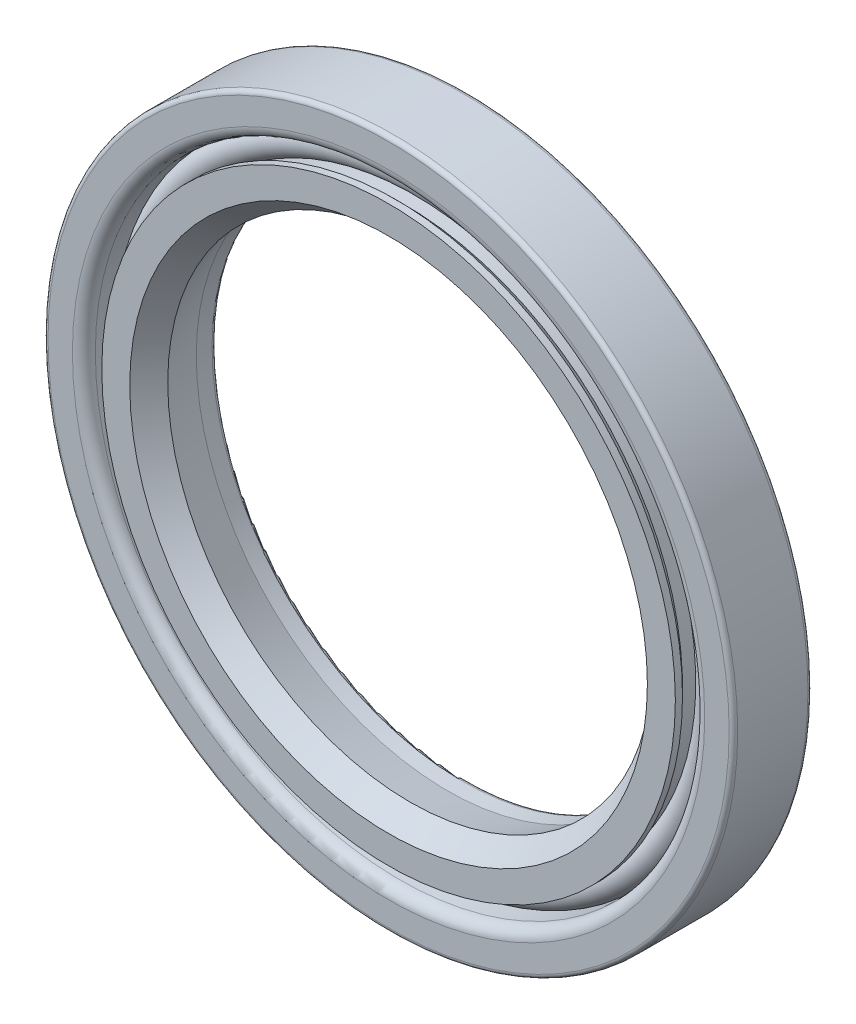
ISO-10303-21;
HEADER;
FILE_DESCRIPTION(('STEP AP214'),'2;1');
FILE_NAME('part.step','',(''),(''),'','','');
FILE_SCHEMA(('AUTOMOTIVE_DESIGN { 1 0 10303 214 1 1 1 1 }'));
ENDSEC;
DATA;
#1=APPLICATION_CONTEXT('core data for automotive mechanical design processes');
#2=APPLICATION_PROTOCOL_DEFINITION('international standard','automotive_design',2000,#1);
#3=PRODUCT_CONTEXT('',#1,'mechanical');
#4=PRODUCT('Part','Part','',(#3));
#5=PRODUCT_RELATED_PRODUCT_CATEGORY('part','',(#4));
#6=PRODUCT_DEFINITION_FORMATION('','',#4);
#7=PRODUCT_DEFINITION_CONTEXT('part definition',#1,'design');
#8=PRODUCT_DEFINITION('design','',#6,#7);
#9=PRODUCT_DEFINITION_SHAPE('','',#8);
#10=(LENGTH_UNIT() NAMED_UNIT(*) SI_UNIT(.MILLI.,.METRE.));
#11=(NAMED_UNIT(*) PLANE_ANGLE_UNIT() SI_UNIT($,.RADIAN.));
#12=(NAMED_UNIT(*) SI_UNIT($,.STERADIAN.) SOLID_ANGLE_UNIT());
#13=UNCERTAINTY_MEASURE_WITH_UNIT(LENGTH_MEASURE(1.E-05),#10,'distance_accuracy_value','');
#14=(GEOMETRIC_REPRESENTATION_CONTEXT(3) GLOBAL_UNCERTAINTY_ASSIGNED_CONTEXT((#13)) GLOBAL_UNIT_ASSIGNED_CONTEXT((#10,
#11,#12)) REPRESENTATION_CONTEXT('',''));
#15=CARTESIAN_POINT('',(0.,0.,0.));
#16=DIRECTION('',(0.,0.,1.));
#17=DIRECTION('',(1.,0.,0.));
#18=AXIS2_PLACEMENT_3D('',#15,#16,#17);
#19=CARTESIAN_POINT('',(0.,23.05,4.5));
#20=DIRECTION('',(0.,0.,1.));
#21=DIRECTION('',(1.,0.,0.));
#22=AXIS2_PLACEMENT_3D('',#19,#20,#21);
#23=PLANE('',#22);
#24=CARTESIAN_POINT('',(0.,0.,4.5));
#25=DIRECTION('',(0.,0.,-1.));
#26=DIRECTION('',(-1.,0.,0.));
#27=AXIS2_PLACEMENT_3D('',#24,#25,#26);
#28=CIRCLE('',#27,22.75);
#29=CARTESIAN_POINT('',(-22.75,0.,4.5));
#30=VERTEX_POINT('',#29);
#31=EDGE_CURVE('E11',#30,#30,#28,.T.);
#32=ORIENTED_EDGE('',*,*,#31,.T.);
#33=EDGE_LOOP('',(#32));
#34=FACE_BOUND('',#33,.T.);
#35=CARTESIAN_POINT('',(0.,0.,4.5));
#36=DIRECTION('',(0.,0.,-1.));
#37=DIRECTION('',(-1.,0.,0.));
#38=AXIS2_PLACEMENT_3D('',#35,#36,#37);
#39=CIRCLE('',#38,23.05);
#40=CARTESIAN_POINT('',(-23.05,0.,4.5));
#41=VERTEX_POINT('',#40);
#42=EDGE_CURVE('E89',#41,#41,#39,.T.);
#43=ORIENTED_EDGE('',*,*,#42,.F.);
#44=EDGE_LOOP('',(#43));
#45=FACE_BOUND('',#44,.T.);
#46=ADVANCED_FACE('F52',(#34,#45),#23,.T.);
#47=CARTESIAN_POINT('',(0.,0.,0.));
#48=DIRECTION('',(0.,0.,-1.));
#49=DIRECTION('',(-1.,0.,0.));
#50=AXIS2_PLACEMENT_3D('',#47,#48,#49);
#51=CYLINDRICAL_SURFACE('',#50,22.75);
#52=CARTESIAN_POINT('',(0.,0.,1.4));
#53=DIRECTION('',(0.,0.,-1.));
#54=DIRECTION('',(-1.,0.,0.));
#55=AXIS2_PLACEMENT_3D('',#52,#53,#54);
#56=CIRCLE('',#55,22.75);
#57=CARTESIAN_POINT('',(-22.75,0.,1.4));
#58=VERTEX_POINT('',#57);
#59=EDGE_CURVE('E59',#58,#58,#56,.T.);
#60=ORIENTED_EDGE('',*,*,#59,.T.);
#61=EDGE_LOOP('',(#60));
#62=FACE_BOUND('',#61,.T.);
#63=ORIENTED_EDGE('',*,*,#31,.F.);
#64=EDGE_LOOP('',(#63));
#65=FACE_BOUND('',#64,.T.);
#66=ADVANCED_FACE('F99',(#62,#65),#51,.F.);
#67=CARTESIAN_POINT('',(0.,0.,1.4));
#68=DIRECTION('',(0.,0.,-1.));
#69=DIRECTION('',(-1.,0.,0.));
#70=AXIS2_PLACEMENT_3D('',#67,#68,#69);
#71=TOROIDAL_SURFACE('',#70,22.25,0.5);
#72=CARTESIAN_POINT('',(0.,0.,0.899999999999998));
#73=DIRECTION('',(0.,0.,-1.));
#74=DIRECTION('',(-1.,0.,0.));
#75=AXIS2_PLACEMENT_3D('',#72,#73,#74);
#76=CIRCLE('',#75,22.25);
#77=CARTESIAN_POINT('',(-22.25,0.,0.899999999999998));
#78=VERTEX_POINT('',#77);
#79=EDGE_CURVE('E65',#78,#78,#76,.T.);
#80=ORIENTED_EDGE('',*,*,#79,.T.);
#81=EDGE_LOOP('',(#80));
#82=FACE_BOUND('',#81,.T.);
#83=ORIENTED_EDGE('',*,*,#59,.F.);
#84=EDGE_LOOP('',(#83));
#85=FACE_BOUND('',#84,.T.);
#86=ADVANCED_FACE('F103',(#82,#85),#71,.F.);
#87=CARTESIAN_POINT('',(0.,19.45,0.899999999999998));
#88=DIRECTION('',(0.,0.,1.));
#89=DIRECTION('',(1.,0.,0.));
#90=AXIS2_PLACEMENT_3D('',#87,#88,#89);
#91=PLANE('',#90);
#92=CARTESIAN_POINT('',(0.,0.,0.899999999999998));
#93=DIRECTION('',(0.,0.,-1.));
#94=DIRECTION('',(-1.,0.,0.));
#95=AXIS2_PLACEMENT_3D('',#92,#93,#94);
#96=CIRCLE('',#95,19.45);
#97=CARTESIAN_POINT('',(-19.45,0.,0.899999999999998));
#98=VERTEX_POINT('',#97);
#99=EDGE_CURVE('E71',#98,#98,#96,.T.);
#100=ORIENTED_EDGE('',*,*,#99,.T.);
#101=EDGE_LOOP('',(#100));
#102=FACE_BOUND('',#101,.T.);
#103=ORIENTED_EDGE('',*,*,#79,.F.);
#104=EDGE_LOOP('',(#103));
#105=FACE_BOUND('',#104,.T.);
#106=ADVANCED_FACE('F107',(#102,#105),#91,.T.);
#107=CARTESIAN_POINT('',(0.,0.,0.));
#108=DIRECTION('',(0.,0.,-1.));
#109=DIRECTION('',(-1.,0.,0.));
#110=AXIS2_PLACEMENT_3D('',#107,#108,#109);
#111=CYLINDRICAL_SURFACE('',#110,19.45);
#112=CARTESIAN_POINT('',(0.,0.,0.599999999999999));
#113=DIRECTION('',(0.,0.,-1.));
#114=DIRECTION('',(-1.,0.,0.));
#115=AXIS2_PLACEMENT_3D('',#112,#113,#114);
#116=CIRCLE('',#115,19.45);
#117=CARTESIAN_POINT('',(-19.45,0.,0.599999999999999));
#118=VERTEX_POINT('',#117);
#119=EDGE_CURVE('E77',#118,#118,#116,.T.);
#120=ORIENTED_EDGE('',*,*,#119,.T.);
#121=EDGE_LOOP('',(#120));
#122=FACE_BOUND('',#121,.T.);
#123=ORIENTED_EDGE('',*,*,#99,.F.);
#124=EDGE_LOOP('',(#123));
#125=FACE_BOUND('',#124,.T.);
#126=ADVANCED_FACE('F114',(#122,#125),#111,.F.);
#127=CARTESIAN_POINT('',(0.,22.25,0.599999999999999));
#128=DIRECTION('',(0.,0.,-1.));
#129=DIRECTION('',(-1.,0.,0.));
#130=AXIS2_PLACEMENT_3D('',#127,#128,#129);
#131=PLANE('',#130);
#132=CARTESIAN_POINT('',(0.,0.,0.6));
#133=DIRECTION('',(0.,0.,-1.));
#134=DIRECTION('',(-1.,0.,0.));
#135=AXIS2_PLACEMENT_3D('',#132,#133,#134);
#136=CIRCLE('',#135,22.25);
#137=CARTESIAN_POINT('',(-22.25,0.,0.6));
#138=VERTEX_POINT('',#137);
#139=EDGE_CURVE('E81',#138,#138,#136,.T.);
#140=ORIENTED_EDGE('',*,*,#139,.T.);
#141=EDGE_LOOP('',(#140));
#142=FACE_BOUND('',#141,.T.);
#143=ORIENTED_EDGE('',*,*,#119,.F.);
#144=EDGE_LOOP('',(#143));
#145=FACE_BOUND('',#144,.T.);
#146=ADVANCED_FACE('F118',(#142,#145),#131,.T.);
#147=CARTESIAN_POINT('',(0.,0.,1.4));
#148=DIRECTION('',(0.,0.,-1.));
#149=DIRECTION('',(-1.,0.,0.));
#150=AXIS2_PLACEMENT_3D('',#147,#148,#149);
#151=TOROIDAL_SURFACE('',#150,22.25,0.799999999999999);
#152=CARTESIAN_POINT('',(0.,0.,1.4));
#153=DIRECTION('',(0.,0.,-1.));
#154=DIRECTION('',(-1.,0.,0.));
#155=AXIS2_PLACEMENT_3D('',#152,#153,#154);
#156=CIRCLE('',#155,23.05);
#157=CARTESIAN_POINT('',(-23.05,0.,1.4));
#158=VERTEX_POINT('',#157);
#159=EDGE_CURVE('E85',#158,#158,#156,.T.);
#160=ORIENTED_EDGE('',*,*,#159,.T.);
#161=EDGE_LOOP('',(#160));
#162=FACE_BOUND('',#161,.T.);
#163=ORIENTED_EDGE('',*,*,#139,.F.);
#164=EDGE_LOOP('',(#163));
#165=FACE_BOUND('',#164,.T.);
#166=ADVANCED_FACE('F122',(#162,#165),#151,.T.);
#167=CARTESIAN_POINT('',(0.,0.,0.));
#168=DIRECTION('',(0.,0.,-1.));
#169=DIRECTION('',(-1.,0.,0.));
#170=AXIS2_PLACEMENT_3D('',#167,#168,#169);
#171=CYLINDRICAL_SURFACE('',#170,23.05);
#172=ORIENTED_EDGE('',*,*,#42,.T.);
#173=EDGE_LOOP('',(#172));
#174=FACE_BOUND('',#173,.T.);
#175=ORIENTED_EDGE('',*,*,#159,.F.);
#176=EDGE_LOOP('',(#175));
#177=FACE_BOUND('',#176,.T.);
#178=ADVANCED_FACE('F95',(#174,#177),#171,.T.);
#179=CLOSED_SHELL('',(#46,#66,#86,#106,#126,#146,#166,#178));
#180=MANIFOLD_SOLID_BREP('B2',#179);
#181=CARTESIAN_POINT('',(0.,0.,3.));
#182=DIRECTION('',(0.,0.,-1.));
#183=DIRECTION('',(-1.,0.,0.));
#184=AXIS2_PLACEMENT_3D('',#181,#182,#183);
#185=TOROIDAL_SURFACE('',#184,20.3388261900637,1.);
#186=CARTESIAN_POINT('',(-21.3388261900637,0.,3.));
#187=VERTEX_POINT('',#186);
#188=VERTEX_LOOP('',#187);
#189=FACE_BOUND('',#188,.T.);
#190=ADVANCED_FACE('F229',(#189),#185,.T.);
#191=CLOSED_SHELL('',(#190));
#192=MANIFOLD_SOLID_BREP('B6',#191);
#193=CARTESIAN_POINT('',(0.,0.,4.7));
#194=DIRECTION('',(0.,0.,-1.));
#195=DIRECTION('',(-1.,0.,0.));
#196=AXIS2_PLACEMENT_3D('',#193,#194,#195);
#197=TOROIDAL_SURFACE('',#196,22.05,0.799999999999999);
#198=CARTESIAN_POINT('',(0.,0.,4.7));
#199=DIRECTION('',(0.,0.,-1.));
#200=DIRECTION('',(-1.,0.,0.));
#201=AXIS2_PLACEMENT_3D('',#198,#199,#200);
#202=CIRCLE('',#201,21.25);
#203=CARTESIAN_POINT('',(-21.25,0.,4.7));
#204=VERTEX_POINT('',#203);
#205=EDGE_CURVE('E228',#204,#204,#202,.T.);
#206=ORIENTED_EDGE('',*,*,#205,.T.);
#207=EDGE_LOOP('',(#206));
#208=FACE_BOUND('',#207,.T.);
#209=CARTESIAN_POINT('',(0.,0.,5.5));
#210=DIRECTION('',(0.,0.,-1.));
#211=DIRECTION('',(-1.,0.,0.));
#212=AXIS2_PLACEMENT_3D('',#209,#210,#211);
#213=CIRCLE('',#212,22.05);
#214=CARTESIAN_POINT('',(-22.05,0.,5.5));
#215=VERTEX_POINT('',#214);
#216=EDGE_CURVE('E323',#215,#215,#213,.T.);
#217=ORIENTED_EDGE('',*,*,#216,.F.);
#218=EDGE_LOOP('',(#217));
#219=FACE_BOUND('',#218,.T.);
#220=ADVANCED_FACE('F246',(#208,#219),#197,.T.);
#221=CARTESIAN_POINT('',(0.,0.,0.));
#222=DIRECTION('',(0.,0.,-1.));
#223=DIRECTION('',(-1.,0.,0.));
#224=AXIS2_PLACEMENT_3D('',#221,#222,#223);
#225=CYLINDRICAL_SURFACE('',#224,21.25);
#226=CARTESIAN_POINT('',(0.,0.,3.3));
#227=DIRECTION('',(0.,0.,-1.));
#228=DIRECTION('',(-1.,0.,0.));
#229=AXIS2_PLACEMENT_3D('',#226,#227,#228);
#230=CIRCLE('',#229,21.25);
#231=CARTESIAN_POINT('',(-21.25,0.,3.3));
#232=VERTEX_POINT('',#231);
#233=EDGE_CURVE('E253',#232,#232,#230,.T.);
#234=ORIENTED_EDGE('',*,*,#233,.T.);
#235=EDGE_LOOP('',(#234));
#236=FACE_BOUND('',#235,.T.);
#237=ORIENTED_EDGE('',*,*,#205,.F.);
#238=EDGE_LOOP('',(#237));
#239=FACE_BOUND('',#238,.T.);
#240=ADVANCED_FACE('F333',(#236,#239),#225,.F.);
#241=CARTESIAN_POINT('',(0.,0.,3.3));
#242=DIRECTION('',(0.,0.,-1.));
#243=DIRECTION('',(-1.,0.,0.));
#244=AXIS2_PLACEMENT_3D('',#241,#242,#243);
#245=TOROIDAL_SURFACE('',#244,20.45,0.799999999999999);
#246=CARTESIAN_POINT('',(0.,0.,2.5));
#247=DIRECTION('',(0.,0.,-1.));
#248=DIRECTION('',(-1.,0.,0.));
#249=AXIS2_PLACEMENT_3D('',#246,#247,#248);
#250=CIRCLE('',#249,20.45);
#251=CARTESIAN_POINT('',(-20.45,0.,2.5));
#252=VERTEX_POINT('',#251);
#253=EDGE_CURVE('E259',#252,#252,#250,.T.);
#254=ORIENTED_EDGE('',*,*,#253,.T.);
#255=EDGE_LOOP('',(#254));
#256=FACE_BOUND('',#255,.T.);
#257=ORIENTED_EDGE('',*,*,#233,.F.);
#258=EDGE_LOOP('',(#257));
#259=FACE_BOUND('',#258,.T.);
#260=ADVANCED_FACE('F337',(#256,#259),#245,.F.);
#261=CARTESIAN_POINT('',(0.,20.45,2.5));
#262=DIRECTION('',(0.,0.,1.));
#263=DIRECTION('',(1.,0.,0.));
#264=AXIS2_PLACEMENT_3D('',#261,#262,#263);
#265=PLANE('',#264);
#266=CARTESIAN_POINT('',(0.,0.,2.5));
#267=DIRECTION('',(0.,0.,-1.));
#268=DIRECTION('',(-1.,0.,0.));
#269=AXIS2_PLACEMENT_3D('',#266,#267,#268);
#270=CIRCLE('',#269,20.25);
#271=CARTESIAN_POINT('',(-20.25,0.,2.5));
#272=VERTEX_POINT('',#271);
#273=EDGE_CURVE('E265',#272,#272,#270,.T.);
#274=ORIENTED_EDGE('',*,*,#273,.T.);
#275=EDGE_LOOP('',(#274));
#276=FACE_BOUND('',#275,.T.);
#277=ORIENTED_EDGE('',*,*,#253,.F.);
#278=EDGE_LOOP('',(#277));
#279=FACE_BOUND('',#278,.T.);
#280=ADVANCED_FACE('F341',(#276,#279),#265,.T.);
#281=CARTESIAN_POINT('',(0.,0.,3.3));
#282=DIRECTION('',(0.,0.,-1.));
#283=DIRECTION('',(-1.,0.,0.));
#284=AXIS2_PLACEMENT_3D('',#281,#282,#283);
#285=TOROIDAL_SURFACE('',#284,20.25,0.800000000000001);
#286=CARTESIAN_POINT('',(0.,0.,3.3));
#287=DIRECTION('',(0.,0.,-1.));
#288=DIRECTION('',(-1.,0.,0.));
#289=AXIS2_PLACEMENT_3D('',#286,#287,#288);
#290=CIRCLE('',#289,19.45);
#291=CARTESIAN_POINT('',(-19.45,0.,3.3));
#292=VERTEX_POINT('',#291);
#293=EDGE_CURVE('E271',#292,#292,#290,.T.);
#294=ORIENTED_EDGE('',*,*,#293,.T.);
#295=EDGE_LOOP('',(#294));
#296=FACE_BOUND('',#295,.T.);
#297=ORIENTED_EDGE('',*,*,#273,.F.);
#298=EDGE_LOOP('',(#297));
#299=FACE_BOUND('',#298,.T.);
#300=ADVANCED_FACE('F348',(#296,#299),#285,.F.);
#301=CARTESIAN_POINT('',(0.,0.,0.));
#302=DIRECTION('',(0.,0.,-1.));
#303=DIRECTION('',(-1.,0.,0.));
#304=AXIS2_PLACEMENT_3D('',#301,#302,#303);
#305=CYLINDRICAL_SURFACE('',#304,19.45);
#306=CARTESIAN_POINT('',(0.,0.,4.45));
#307=DIRECTION('',(0.,0.,-1.));
#308=DIRECTION('',(-1.,0.,0.));
#309=AXIS2_PLACEMENT_3D('',#306,#307,#308);
#310=CIRCLE('',#309,19.45);
#311=CARTESIAN_POINT('',(-19.45,0.,4.45));
#312=VERTEX_POINT('',#311);
#313=EDGE_CURVE('E275',#312,#312,#310,.T.);
#314=ORIENTED_EDGE('',*,*,#313,.T.);
#315=EDGE_LOOP('',(#314));
#316=FACE_BOUND('',#315,.T.);
#317=ORIENTED_EDGE('',*,*,#293,.F.);
#318=EDGE_LOOP('',(#317));
#319=FACE_BOUND('',#318,.T.);
#320=ADVANCED_FACE('F352',(#316,#319),#305,.T.);
#321=CARTESIAN_POINT('',(0.,0.,4.45));
#322=DIRECTION('',(0.,0.,1.));
#323=DIRECTION('',(1.,0.,0.));
#324=AXIS2_PLACEMENT_3D('',#321,#322,#323);
#325=CONICAL_SURFACE('',#324,19.45,0.785398163397448);
#326=CARTESIAN_POINT('',(0.,0.,5.));
#327=DIRECTION('',(0.,0.,-1.));
#328=DIRECTION('',(-1.,0.,0.));
#329=AXIS2_PLACEMENT_3D('',#326,#327,#328);
#330=CIRCLE('',#329,20.);
#331=CARTESIAN_POINT('',(-20.,0.,5.));
#332=VERTEX_POINT('',#331);
#333=EDGE_CURVE('E279',#332,#332,#330,.T.);
#334=ORIENTED_EDGE('',*,*,#333,.T.);
#335=EDGE_LOOP('',(#334));
#336=FACE_BOUND('',#335,.T.);
#337=ORIENTED_EDGE('',*,*,#313,.F.);
#338=EDGE_LOOP('',(#337));
#339=FACE_BOUND('',#338,.T.);
#340=ADVANCED_FACE('F356',(#336,#339),#325,.T.);
#341=CARTESIAN_POINT('',(0.,0.,0.));
#342=DIRECTION('',(0.,0.,-1.));
#343=DIRECTION('',(-1.,0.,0.));
#344=AXIS2_PLACEMENT_3D('',#341,#342,#343);
#345=CYLINDRICAL_SURFACE('',#344,20.);
#346=CARTESIAN_POINT('',(0.,0.,5.5));
#347=DIRECTION('',(0.,0.,-1.));
#348=DIRECTION('',(-1.,0.,0.));
#349=AXIS2_PLACEMENT_3D('',#346,#347,#348);
#350=CIRCLE('',#349,20.);
#351=CARTESIAN_POINT('',(-20.,0.,5.5));
#352=VERTEX_POINT('',#351);
#353=EDGE_CURVE('E283',#352,#352,#350,.T.);
#354=ORIENTED_EDGE('',*,*,#353,.T.);
#355=EDGE_LOOP('',(#354));
#356=FACE_BOUND('',#355,.T.);
#357=ORIENTED_EDGE('',*,*,#333,.F.);
#358=EDGE_LOOP('',(#357));
#359=FACE_BOUND('',#358,.T.);
#360=ADVANCED_FACE('F360',(#356,#359),#345,.T.);
#361=CARTESIAN_POINT('',(0.,18.05,5.5));
#362=DIRECTION('',(0.,0.,1.));
#363=DIRECTION('',(1.,0.,0.));
#364=AXIS2_PLACEMENT_3D('',#361,#362,#363);
#365=PLANE('',#364);
#366=CARTESIAN_POINT('',(0.,0.,5.5));
#367=DIRECTION('',(0.,0.,-1.));
#368=DIRECTION('',(-1.,0.,0.));
#369=AXIS2_PLACEMENT_3D('',#366,#367,#368);
#370=CIRCLE('',#369,18.05);
#371=CARTESIAN_POINT('',(-18.05,0.,5.5));
#372=VERTEX_POINT('',#371);
#373=EDGE_CURVE('E287',#372,#372,#370,.T.);
#374=ORIENTED_EDGE('',*,*,#373,.T.);
#375=EDGE_LOOP('',(#374));
#376=FACE_BOUND('',#375,.T.);
#377=ORIENTED_EDGE('',*,*,#353,.F.);
#378=EDGE_LOOP('',(#377));
#379=FACE_BOUND('',#378,.T.);
#380=ADVANCED_FACE('F364',(#376,#379),#365,.T.);
#381=CARTESIAN_POINT('',(0.,0.,5.5));
#382=DIRECTION('',(0.,0.,1.));
#383=DIRECTION('',(1.,0.,0.));
#384=AXIS2_PLACEMENT_3D('',#381,#382,#383);
#385=CONICAL_SURFACE('',#384,18.05,0.654082724414361);
#386=CARTESIAN_POINT('',(0.,0.,4.));
#387=DIRECTION('',(0.,0.,-1.));
#388=DIRECTION('',(-1.,0.,0.));
#389=AXIS2_PLACEMENT_3D('',#386,#387,#388);
#390=CIRCLE('',#389,16.9);
#391=CARTESIAN_POINT('',(-16.9,0.,4.));
#392=VERTEX_POINT('',#391);
#393=EDGE_CURVE('E291',#392,#392,#390,.T.);
#394=ORIENTED_EDGE('',*,*,#393,.T.);
#395=EDGE_LOOP('',(#394));
#396=FACE_BOUND('',#395,.T.);
#397=ORIENTED_EDGE('',*,*,#373,.F.);
#398=EDGE_LOOP('',(#397));
#399=FACE_BOUND('',#398,.T.);
#400=ADVANCED_FACE('F368',(#396,#399),#385,.F.);
#401=CARTESIAN_POINT('',(0.,0.,4.));
#402=DIRECTION('',(0.,0.,-1.));
#403=DIRECTION('',(-1.,0.,0.));
#404=AXIS2_PLACEMENT_3D('',#401,#402,#403);
#405=CONICAL_SURFACE('',#404,16.9,0.230447442584778);
#406=CARTESIAN_POINT('',(0.,0.,1.4));
#407=DIRECTION('',(0.,0.,-1.));
#408=DIRECTION('',(-1.,0.,0.));
#409=AXIS2_PLACEMENT_3D('',#406,#407,#408);
#410=CIRCLE('',#409,17.51);
#411=CARTESIAN_POINT('',(-17.51,0.,1.4));
#412=VERTEX_POINT('',#411);
#413=EDGE_CURVE('E295',#412,#412,#410,.T.);
#414=ORIENTED_EDGE('',*,*,#413,.T.);
#415=EDGE_LOOP('',(#414));
#416=FACE_BOUND('',#415,.T.);
#417=ORIENTED_EDGE('',*,*,#393,.F.);
#418=EDGE_LOOP('',(#417));
#419=FACE_BOUND('',#418,.T.);
#420=ADVANCED_FACE('F372',(#416,#419),#405,.F.);
#421=CARTESIAN_POINT('',(0.,0.,0.));
#422=DIRECTION('',(0.,0.,-1.));
#423=DIRECTION('',(-1.,0.,0.));
#424=AXIS2_PLACEMENT_3D('',#421,#422,#423);
#425=CYLINDRICAL_SURFACE('',#424,17.51);
#426=CARTESIAN_POINT('',(0.,0.,0.3));
#427=DIRECTION('',(0.,0.,-1.));
#428=DIRECTION('',(-1.,0.,0.));
#429=AXIS2_PLACEMENT_3D('',#426,#427,#428);
#430=CIRCLE('',#429,17.51);
#431=CARTESIAN_POINT('',(-17.51,0.,0.3));
#432=VERTEX_POINT('',#431);
#433=EDGE_CURVE('E299',#432,#432,#430,.T.);
#434=ORIENTED_EDGE('',*,*,#433,.T.);
#435=EDGE_LOOP('',(#434));
#436=FACE_BOUND('',#435,.T.);
#437=ORIENTED_EDGE('',*,*,#413,.F.);
#438=EDGE_LOOP('',(#437));
#439=FACE_BOUND('',#438,.T.);
#440=ADVANCED_FACE('F376',(#436,#439),#425,.F.);
#441=CARTESIAN_POINT('',(0.,0.,0.3));
#442=DIRECTION('',(0.,0.,-1.));
#443=DIRECTION('',(-1.,0.,0.));
#444=AXIS2_PLACEMENT_3D('',#441,#442,#443);
#445=TOROIDAL_SURFACE('',#444,17.81,0.299999999999999);
#446=CARTESIAN_POINT('',(0.,0.,0.));
#447=DIRECTION('',(0.,0.,-1.));
#448=DIRECTION('',(-1.,0.,0.));
#449=AXIS2_PLACEMENT_3D('',#446,#447,#448);
#450=CIRCLE('',#449,17.81);
#451=CARTESIAN_POINT('',(-17.81,0.,0.));
#452=VERTEX_POINT('',#451);
#453=EDGE_CURVE('E303',#452,#452,#450,.T.);
#454=ORIENTED_EDGE('',*,*,#453,.T.);
#455=EDGE_LOOP('',(#454));
#456=FACE_BOUND('',#455,.T.);
#457=ORIENTED_EDGE('',*,*,#433,.F.);
#458=EDGE_LOOP('',(#457));
#459=FACE_BOUND('',#458,.T.);
#460=ADVANCED_FACE('F380',(#456,#459),#445,.T.);
#461=CARTESIAN_POINT('',(0.,17.81,0.));
#462=DIRECTION('',(0.,0.,-1.));
#463=DIRECTION('',(-1.,0.,0.));
#464=AXIS2_PLACEMENT_3D('',#461,#462,#463);
#465=PLANE('',#464);
#466=CARTESIAN_POINT('',(0.,0.,0.));
#467=DIRECTION('',(0.,0.,-1.));
#468=DIRECTION('',(-1.,0.,0.));
#469=AXIS2_PLACEMENT_3D('',#466,#467,#468);
#470=CIRCLE('',#469,23.75);
#471=CARTESIAN_POINT('',(-23.75,0.,0.));
#472=VERTEX_POINT('',#471);
#473=EDGE_CURVE('E307',#472,#472,#470,.T.);
#474=ORIENTED_EDGE('',*,*,#473,.T.);
#475=EDGE_LOOP('',(#474));
#476=FACE_BOUND('',#475,.T.);
#477=ORIENTED_EDGE('',*,*,#453,.F.);
#478=EDGE_LOOP('',(#477));
#479=FACE_BOUND('',#478,.T.);
#480=ADVANCED_FACE('F384',(#476,#479),#465,.T.);
#481=CARTESIAN_POINT('',(0.,0.,0.300000000000001));
#482=DIRECTION('',(0.,0.,-1.));
#483=DIRECTION('',(-1.,0.,0.));
#484=AXIS2_PLACEMENT_3D('',#481,#482,#483);
#485=TOROIDAL_SURFACE('',#484,23.75,0.300000000000003);
#486=CARTESIAN_POINT('',(0.,0.,0.300000000000001));
#487=DIRECTION('',(0.,0.,-1.));
#488=DIRECTION('',(-1.,0.,0.));
#489=AXIS2_PLACEMENT_3D('',#486,#487,#488);
#490=CIRCLE('',#489,24.05);
#491=CARTESIAN_POINT('',(-24.05,0.,0.300000000000001));
#492=VERTEX_POINT('',#491);
#493=EDGE_CURVE('E311',#492,#492,#490,.T.);
#494=ORIENTED_EDGE('',*,*,#493,.T.);
#495=EDGE_LOOP('',(#494));
#496=FACE_BOUND('',#495,.T.);
#497=ORIENTED_EDGE('',*,*,#473,.F.);
#498=EDGE_LOOP('',(#497));
#499=FACE_BOUND('',#498,.T.);
#500=ADVANCED_FACE('F388',(#496,#499),#485,.T.);
#501=CARTESIAN_POINT('',(0.,0.,0.));
#502=DIRECTION('',(0.,0.,-1.));
#503=DIRECTION('',(-1.,0.,0.));
#504=AXIS2_PLACEMENT_3D('',#501,#502,#503);
#505=CYLINDRICAL_SURFACE('',#504,24.05);
#506=CARTESIAN_POINT('',(0.,0.,5.2));
#507=DIRECTION('',(0.,0.,-1.));
#508=DIRECTION('',(-1.,0.,0.));
#509=AXIS2_PLACEMENT_3D('',#506,#507,#508);
#510=CIRCLE('',#509,24.05);
#511=CARTESIAN_POINT('',(-24.05,0.,5.2));
#512=VERTEX_POINT('',#511);
#513=EDGE_CURVE('E315',#512,#512,#510,.T.);
#514=ORIENTED_EDGE('',*,*,#513,.T.);
#515=EDGE_LOOP('',(#514));
#516=FACE_BOUND('',#515,.T.);
#517=ORIENTED_EDGE('',*,*,#493,.F.);
#518=EDGE_LOOP('',(#517));
#519=FACE_BOUND('',#518,.T.);
#520=ADVANCED_FACE('F392',(#516,#519),#505,.T.);
#521=CARTESIAN_POINT('',(0.,0.,5.2));
#522=DIRECTION('',(0.,0.,-1.));
#523=DIRECTION('',(-1.,0.,0.));
#524=AXIS2_PLACEMENT_3D('',#521,#522,#523);
#525=TOROIDAL_SURFACE('',#524,23.75,0.300000000000003);
#526=CARTESIAN_POINT('',(0.,0.,5.5));
#527=DIRECTION('',(0.,0.,-1.));
#528=DIRECTION('',(-1.,0.,0.));
#529=AXIS2_PLACEMENT_3D('',#526,#527,#528);
#530=CIRCLE('',#529,23.75);
#531=CARTESIAN_POINT('',(-23.75,0.,5.5));
#532=VERTEX_POINT('',#531);
#533=EDGE_CURVE('E319',#532,#532,#530,.T.);
#534=ORIENTED_EDGE('',*,*,#533,.T.);
#535=EDGE_LOOP('',(#534));
#536=FACE_BOUND('',#535,.T.);
#537=ORIENTED_EDGE('',*,*,#513,.F.);
#538=EDGE_LOOP('',(#537));
#539=FACE_BOUND('',#538,.T.);
#540=ADVANCED_FACE('F396',(#536,#539),#525,.T.);
#541=CARTESIAN_POINT('',(0.,23.75,5.5));
#542=DIRECTION('',(0.,0.,1.));
#543=DIRECTION('',(1.,0.,0.));
#544=AXIS2_PLACEMENT_3D('',#541,#542,#543);
#545=PLANE('',#544);
#546=ORIENTED_EDGE('',*,*,#216,.T.);
#547=EDGE_LOOP('',(#546));
#548=FACE_BOUND('',#547,.T.);
#549=ORIENTED_EDGE('',*,*,#533,.F.);
#550=EDGE_LOOP('',(#549));
#551=FACE_BOUND('',#550,.T.);
#552=ADVANCED_FACE('F329',(#548,#551),#545,.T.);
#553=CLOSED_SHELL('',(#220,#240,#260,#280,#300,#320,#340,#360,#380,#400,#420,#440,#460,#480,
#500,#520,#540,#552));
#554=MANIFOLD_SOLID_BREP('B48',#553);
#555=ADVANCED_BREP_SHAPE_REPRESENTATION('',(#18,#180,#192,#554),#14);
#556=SHAPE_DEFINITION_REPRESENTATION(#9,#555);
ENDSEC;
END-ISO-10303-21;
